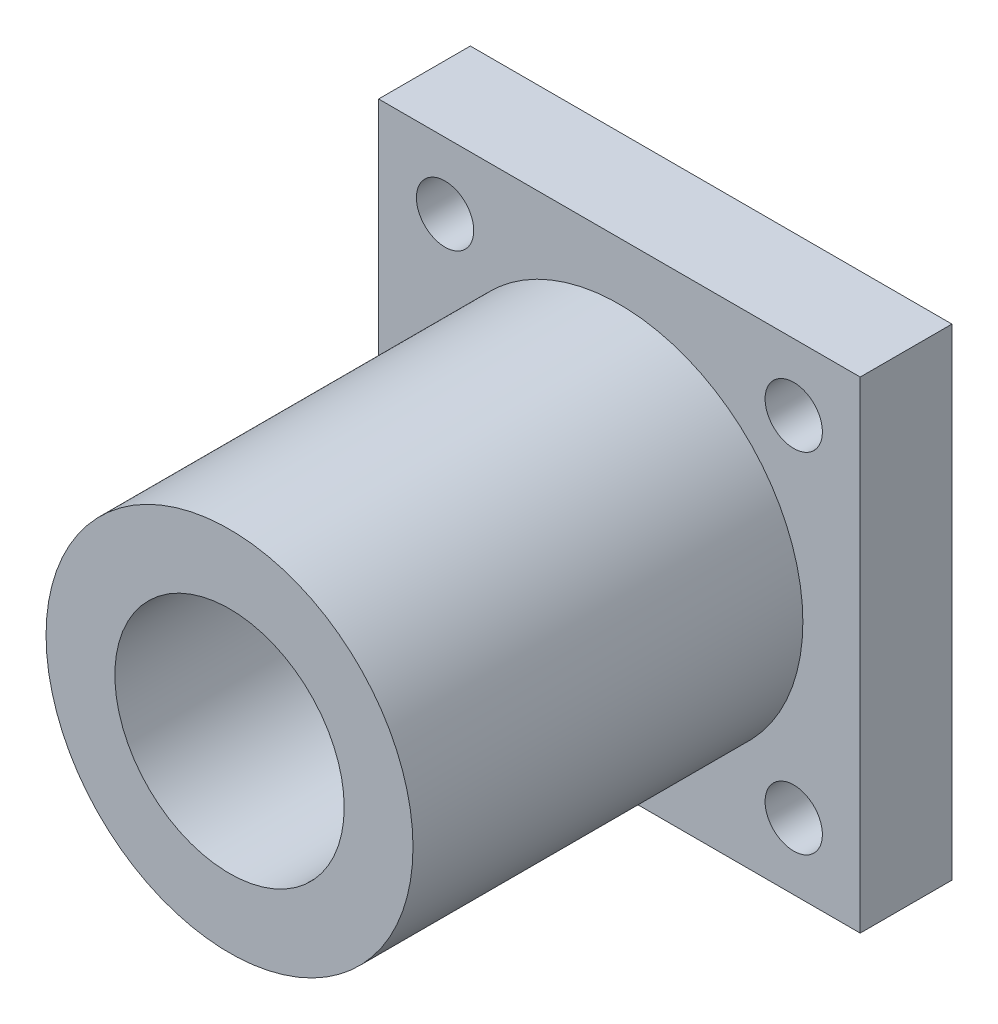
ISO-10303-21;
HEADER;
FILE_DESCRIPTION(('STEP AP214'),'2;1');
FILE_NAME('part.step','',(''),(''),'','','');
FILE_SCHEMA(('AUTOMOTIVE_DESIGN { 1 0 10303 214 1 1 1 1 }'));
ENDSEC;
DATA;
#1=APPLICATION_CONTEXT('core data for automotive mechanical design processes');
#2=APPLICATION_PROTOCOL_DEFINITION('international standard','automotive_design',2000,#1);
#3=PRODUCT_CONTEXT('',#1,'mechanical');
#4=PRODUCT('Part','Part','',(#3));
#5=PRODUCT_RELATED_PRODUCT_CATEGORY('part','',(#4));
#6=PRODUCT_DEFINITION_FORMATION('','',#4);
#7=PRODUCT_DEFINITION_CONTEXT('part definition',#1,'design');
#8=PRODUCT_DEFINITION('design','',#6,#7);
#9=PRODUCT_DEFINITION_SHAPE('','',#8);
#10=(LENGTH_UNIT() NAMED_UNIT(*) SI_UNIT(.MILLI.,.METRE.));
#11=(NAMED_UNIT(*) PLANE_ANGLE_UNIT() SI_UNIT($,.RADIAN.));
#12=(NAMED_UNIT(*) SI_UNIT($,.STERADIAN.) SOLID_ANGLE_UNIT());
#13=UNCERTAINTY_MEASURE_WITH_UNIT(LENGTH_MEASURE(1.E-05),#10,'distance_accuracy_value','');
#14=(GEOMETRIC_REPRESENTATION_CONTEXT(3) GLOBAL_UNCERTAINTY_ASSIGNED_CONTEXT((#13)) GLOBAL_UNIT_ASSIGNED_CONTEXT((#10,
#11,#12)) REPRESENTATION_CONTEXT('',''));
#15=CARTESIAN_POINT('',(0.,0.,0.));
#16=DIRECTION('',(0.,0.,1.));
#17=DIRECTION('',(1.,0.,0.));
#18=AXIS2_PLACEMENT_3D('',#15,#16,#17);
#19=CARTESIAN_POINT('',(-21.,0.,8.));
#20=DIRECTION('',(-1.,0.,0.));
#21=DIRECTION('',(0.,0.,1.));
#22=AXIS2_PLACEMENT_3D('',#19,#20,#21);
#23=PLANE('',#22);
#24=DIRECTION('',(0.,1.,0.));
#25=VECTOR('',#24,1.);
#26=CARTESIAN_POINT('',(-21.,0.,0.));
#27=LINE('',#26,#25);
#28=CARTESIAN_POINT('',(-21.,-21.,0.));
#29=VERTEX_POINT('',#28);
#30=CARTESIAN_POINT('',(-21.,21.,0.));
#31=VERTEX_POINT('',#30);
#32=EDGE_CURVE('E117',#29,#31,#27,.T.);
#33=ORIENTED_EDGE('',*,*,#32,.F.);
#34=DIRECTION('',(0.,0.,-1.));
#35=VECTOR('',#34,1.);
#36=CARTESIAN_POINT('',(-21.,-21.,8.));
#37=LINE('',#36,#35);
#38=CARTESIAN_POINT('',(-21.,-21.,8.));
#39=VERTEX_POINT('',#38);
#40=EDGE_CURVE('E11',#39,#29,#37,.T.);
#41=ORIENTED_EDGE('',*,*,#40,.F.);
#42=DIRECTION('',(0.,1.,0.));
#43=VECTOR('',#42,1.);
#44=CARTESIAN_POINT('',(-21.,0.,8.));
#45=LINE('',#44,#43);
#46=CARTESIAN_POINT('',(-21.,21.,8.));
#47=VERTEX_POINT('',#46);
#48=EDGE_CURVE('E97',#39,#47,#45,.T.);
#49=ORIENTED_EDGE('',*,*,#48,.T.);
#50=DIRECTION('',(0.,0.,-1.));
#51=VECTOR('',#50,1.);
#52=CARTESIAN_POINT('',(-21.,21.,8.));
#53=LINE('',#52,#51);
#54=EDGE_CURVE('E76',#47,#31,#53,.T.);
#55=ORIENTED_EDGE('',*,*,#54,.T.);
#56=EDGE_LOOP('',(#33,#41,#49,#55));
#57=FACE_BOUND('',#56,.T.);
#58=ADVANCED_FACE('F36',(#57),#23,.T.);
#59=CARTESIAN_POINT('',(0.,-21.,8.));
#60=DIRECTION('',(0.,-1.,0.));
#61=DIRECTION('',(1.,0.,0.));
#62=AXIS2_PLACEMENT_3D('',#59,#60,#61);
#63=PLANE('',#62);
#64=DIRECTION('',(-1.,0.,0.));
#65=VECTOR('',#64,1.);
#66=CARTESIAN_POINT('',(0.,-21.,0.));
#67=LINE('',#66,#65);
#68=CARTESIAN_POINT('',(21.,-21.,0.));
#69=VERTEX_POINT('',#68);
#70=EDGE_CURVE('E88',#69,#29,#67,.T.);
#71=ORIENTED_EDGE('',*,*,#70,.F.);
#72=DIRECTION('',(0.,0.,-1.));
#73=VECTOR('',#72,1.);
#74=CARTESIAN_POINT('',(21.,-21.,8.));
#75=LINE('',#74,#73);
#76=CARTESIAN_POINT('',(21.,-21.,8.));
#77=VERTEX_POINT('',#76);
#78=EDGE_CURVE('E45',#77,#69,#75,.T.);
#79=ORIENTED_EDGE('',*,*,#78,.F.);
#80=DIRECTION('',(-1.,0.,0.));
#81=VECTOR('',#80,1.);
#82=CARTESIAN_POINT('',(0.,-21.,8.));
#83=LINE('',#82,#81);
#84=EDGE_CURVE('E86',#77,#39,#83,.T.);
#85=ORIENTED_EDGE('',*,*,#84,.T.);
#86=ORIENTED_EDGE('',*,*,#40,.T.);
#87=EDGE_LOOP('',(#71,#79,#85,#86));
#88=FACE_BOUND('',#87,.T.);
#89=ADVANCED_FACE('F84',(#88),#63,.T.);
#90=CARTESIAN_POINT('',(21.,0.,8.));
#91=DIRECTION('',(-1.,0.,0.));
#92=DIRECTION('',(0.,0.,1.));
#93=AXIS2_PLACEMENT_3D('',#90,#91,#92);
#94=PLANE('',#93);
#95=DIRECTION('',(0.,1.,0.));
#96=VECTOR('',#95,1.);
#97=CARTESIAN_POINT('',(21.,0.,0.));
#98=LINE('',#97,#96);
#99=CARTESIAN_POINT('',(21.,21.,0.));
#100=VERTEX_POINT('',#99);
#101=EDGE_CURVE('E120',#69,#100,#98,.T.);
#102=ORIENTED_EDGE('',*,*,#101,.T.);
#103=DIRECTION('',(0.,0.,-1.));
#104=VECTOR('',#103,1.);
#105=CARTESIAN_POINT('',(21.,21.,8.));
#106=LINE('',#105,#104);
#107=CARTESIAN_POINT('',(21.,21.,8.));
#108=VERTEX_POINT('',#107);
#109=EDGE_CURVE('E91',#108,#100,#106,.T.);
#110=ORIENTED_EDGE('',*,*,#109,.F.);
#111=DIRECTION('',(0.,1.,0.));
#112=VECTOR('',#111,1.);
#113=CARTESIAN_POINT('',(21.,0.,8.));
#114=LINE('',#113,#112);
#115=EDGE_CURVE('E93',#77,#108,#114,.T.);
#116=ORIENTED_EDGE('',*,*,#115,.F.);
#117=ORIENTED_EDGE('',*,*,#78,.T.);
#118=EDGE_LOOP('',(#102,#110,#116,#117));
#119=FACE_BOUND('',#118,.T.);
#120=ADVANCED_FACE('F94',(#119),#94,.F.);
#121=CARTESIAN_POINT('',(0.,21.,8.));
#122=DIRECTION('',(0.,-1.,0.));
#123=DIRECTION('',(1.,0.,0.));
#124=AXIS2_PLACEMENT_3D('',#121,#122,#123);
#125=PLANE('',#124);
#126=DIRECTION('',(-1.,0.,0.));
#127=VECTOR('',#126,1.);
#128=CARTESIAN_POINT('',(0.,21.,0.));
#129=LINE('',#128,#127);
#130=EDGE_CURVE('E69',#100,#31,#129,.T.);
#131=ORIENTED_EDGE('',*,*,#130,.T.);
#132=ORIENTED_EDGE('',*,*,#54,.F.);
#133=DIRECTION('',(-1.,0.,0.));
#134=VECTOR('',#133,1.);
#135=CARTESIAN_POINT('',(0.,21.,8.));
#136=LINE('',#135,#134);
#137=EDGE_CURVE('E53',#108,#47,#136,.T.);
#138=ORIENTED_EDGE('',*,*,#137,.F.);
#139=ORIENTED_EDGE('',*,*,#109,.T.);
#140=EDGE_LOOP('',(#131,#132,#138,#139));
#141=FACE_BOUND('',#140,.T.);
#142=ADVANCED_FACE('F129',(#141),#125,.F.);
#143=CARTESIAN_POINT('',(-15.2027957955108,15.2027957955108,8.));
#144=DIRECTION('',(0.,0.,-1.));
#145=DIRECTION('',(-1.,0.,0.));
#146=AXIS2_PLACEMENT_3D('',#143,#144,#145);
#147=CYLINDRICAL_SURFACE('',#146,2.5);
#148=CARTESIAN_POINT('',(-15.2027957955108,15.2027957955108,8.));
#149=DIRECTION('',(0.,0.,1.));
#150=DIRECTION('',(1.,0.,0.));
#151=AXIS2_PLACEMENT_3D('',#148,#149,#150);
#152=CIRCLE('',#151,2.5);
#153=CARTESIAN_POINT('',(-12.7027957955108,15.2027957955108,8.));
#154=VERTEX_POINT('',#153);
#155=EDGE_CURVE('E99',#154,#154,#152,.T.);
#156=ORIENTED_EDGE('',*,*,#155,.T.);
#157=EDGE_LOOP('',(#156));
#158=FACE_BOUND('',#157,.T.);
#159=CARTESIAN_POINT('',(-15.2027957955108,15.2027957955108,0.));
#160=DIRECTION('',(0.,0.,1.));
#161=DIRECTION('',(1.,0.,0.));
#162=AXIS2_PLACEMENT_3D('',#159,#160,#161);
#163=CIRCLE('',#162,2.5);
#164=CARTESIAN_POINT('',(-12.7027957955108,15.2027957955108,0.));
#165=VERTEX_POINT('',#164);
#166=EDGE_CURVE('E114',#165,#165,#163,.T.);
#167=ORIENTED_EDGE('',*,*,#166,.F.);
#168=EDGE_LOOP('',(#167));
#169=FACE_BOUND('',#168,.T.);
#170=ADVANCED_FACE('F140',(#158,#169),#147,.F.);
#171=CARTESIAN_POINT('',(15.2027957955108,15.2027957955108,8.));
#172=DIRECTION('',(0.,0.,-1.));
#173=DIRECTION('',(-1.,0.,0.));
#174=AXIS2_PLACEMENT_3D('',#171,#172,#173);
#175=CYLINDRICAL_SURFACE('',#174,2.5);
#176=CARTESIAN_POINT('',(15.2027957955108,15.2027957955108,8.));
#177=DIRECTION('',(0.,0.,1.));
#178=DIRECTION('',(1.,0.,0.));
#179=AXIS2_PLACEMENT_3D('',#176,#177,#178);
#180=CIRCLE('',#179,2.5);
#181=CARTESIAN_POINT('',(17.7027957955108,15.2027957955108,8.));
#182=VERTEX_POINT('',#181);
#183=EDGE_CURVE('E266',#182,#182,#180,.T.);
#184=ORIENTED_EDGE('',*,*,#183,.T.);
#185=EDGE_LOOP('',(#184));
#186=FACE_BOUND('',#185,.T.);
#187=CARTESIAN_POINT('',(15.2027957955108,15.2027957955108,0.));
#188=DIRECTION('',(0.,0.,1.));
#189=DIRECTION('',(1.,0.,0.));
#190=AXIS2_PLACEMENT_3D('',#187,#188,#189);
#191=CIRCLE('',#190,2.5);
#192=CARTESIAN_POINT('',(17.7027957955108,15.2027957955108,0.));
#193=VERTEX_POINT('',#192);
#194=EDGE_CURVE('E111',#193,#193,#191,.T.);
#195=ORIENTED_EDGE('',*,*,#194,.F.);
#196=EDGE_LOOP('',(#195));
#197=FACE_BOUND('',#196,.T.);
#198=ADVANCED_FACE('F143',(#186,#197),#175,.F.);
#199=CARTESIAN_POINT('',(15.2027957955108,-15.2027957955108,8.));
#200=DIRECTION('',(0.,0.,-1.));
#201=DIRECTION('',(-1.,0.,0.));
#202=AXIS2_PLACEMENT_3D('',#199,#200,#201);
#203=CYLINDRICAL_SURFACE('',#202,2.5);
#204=CARTESIAN_POINT('',(15.2027957955108,-15.2027957955108,8.));
#205=DIRECTION('',(0.,0.,1.));
#206=DIRECTION('',(1.,0.,0.));
#207=AXIS2_PLACEMENT_3D('',#204,#205,#206);
#208=CIRCLE('',#207,2.5);
#209=CARTESIAN_POINT('',(17.7027957955108,-15.2027957955108,8.));
#210=VERTEX_POINT('',#209);
#211=EDGE_CURVE('E158',#210,#210,#208,.T.);
#212=ORIENTED_EDGE('',*,*,#211,.T.);
#213=EDGE_LOOP('',(#212));
#214=FACE_BOUND('',#213,.T.);
#215=CARTESIAN_POINT('',(15.2027957955108,-15.2027957955108,0.));
#216=DIRECTION('',(0.,0.,1.));
#217=DIRECTION('',(1.,0.,0.));
#218=AXIS2_PLACEMENT_3D('',#215,#216,#217);
#219=CIRCLE('',#218,2.5);
#220=CARTESIAN_POINT('',(17.7027957955108,-15.2027957955108,0.));
#221=VERTEX_POINT('',#220);
#222=EDGE_CURVE('E107',#221,#221,#219,.T.);
#223=ORIENTED_EDGE('',*,*,#222,.F.);
#224=EDGE_LOOP('',(#223));
#225=FACE_BOUND('',#224,.T.);
#226=ADVANCED_FACE('F146',(#214,#225),#203,.F.);
#227=CARTESIAN_POINT('',(-15.2027957955108,-15.2027957955108,8.));
#228=DIRECTION('',(0.,0.,-1.));
#229=DIRECTION('',(-1.,0.,0.));
#230=AXIS2_PLACEMENT_3D('',#227,#228,#229);
#231=CYLINDRICAL_SURFACE('',#230,2.5);
#232=CARTESIAN_POINT('',(-15.2027957955108,-15.2027957955108,8.));
#233=DIRECTION('',(0.,0.,1.));
#234=DIRECTION('',(1.,0.,0.));
#235=AXIS2_PLACEMENT_3D('',#232,#233,#234);
#236=CIRCLE('',#235,2.5);
#237=CARTESIAN_POINT('',(-12.7027957955108,-15.2027957955108,8.));
#238=VERTEX_POINT('',#237);
#239=EDGE_CURVE('E126',#238,#238,#236,.T.);
#240=ORIENTED_EDGE('',*,*,#239,.T.);
#241=EDGE_LOOP('',(#240));
#242=FACE_BOUND('',#241,.T.);
#243=CARTESIAN_POINT('',(-15.2027957955108,-15.2027957955108,0.));
#244=DIRECTION('',(0.,0.,1.));
#245=DIRECTION('',(1.,0.,0.));
#246=AXIS2_PLACEMENT_3D('',#243,#244,#245);
#247=CIRCLE('',#246,2.5);
#248=CARTESIAN_POINT('',(-12.7027957955108,-15.2027957955108,0.));
#249=VERTEX_POINT('',#248);
#250=EDGE_CURVE('E104',#249,#249,#247,.T.);
#251=ORIENTED_EDGE('',*,*,#250,.F.);
#252=EDGE_LOOP('',(#251));
#253=FACE_BOUND('',#252,.T.);
#254=ADVANCED_FACE('F38',(#242,#253),#231,.F.);
#255=CARTESIAN_POINT('',(0.,0.,8.));
#256=DIRECTION('',(0.,0.,-1.));
#257=DIRECTION('',(-1.,0.,0.));
#258=AXIS2_PLACEMENT_3D('',#255,#256,#257);
#259=CYLINDRICAL_SURFACE('',#258,10.);
#260=CARTESIAN_POINT('',(0.,0.,0.));
#261=DIRECTION('',(0.,0.,1.));
#262=DIRECTION('',(1.,0.,0.));
#263=AXIS2_PLACEMENT_3D('',#260,#261,#262);
#264=CIRCLE('',#263,10.);
#265=CARTESIAN_POINT('',(10.,0.,0.));
#266=VERTEX_POINT('',#265);
#267=EDGE_CURVE('E123',#266,#266,#264,.T.);
#268=ORIENTED_EDGE('',*,*,#267,.F.);
#269=EDGE_LOOP('',(#268));
#270=FACE_BOUND('',#269,.T.);
#271=CARTESIAN_POINT('',(0.,0.,42.));
#272=DIRECTION('',(0.,0.,1.));
#273=DIRECTION('',(1.,0.,0.));
#274=AXIS2_PLACEMENT_3D('',#271,#272,#273);
#275=CIRCLE('',#274,10.);
#276=CARTESIAN_POINT('',(10.,0.,42.));
#277=VERTEX_POINT('',#276);
#278=EDGE_CURVE('E253',#277,#277,#275,.T.);
#279=ORIENTED_EDGE('',*,*,#278,.T.);
#280=EDGE_LOOP('',(#279));
#281=FACE_BOUND('',#280,.T.);
#282=ADVANCED_FACE('F153',(#270,#281),#259,.F.);
#283=CARTESIAN_POINT('',(0.,0.,8.));
#284=DIRECTION('',(0.,0.,1.));
#285=DIRECTION('',(1.,0.,0.));
#286=AXIS2_PLACEMENT_3D('',#283,#284,#285);
#287=PLANE('',#286);
#288=CARTESIAN_POINT('',(0.,0.,8.));
#289=DIRECTION('',(0.,0.,1.));
#290=DIRECTION('',(1.,0.,0.));
#291=AXIS2_PLACEMENT_3D('',#288,#289,#290);
#292=CIRCLE('',#291,16.);
#293=CARTESIAN_POINT('',(-16.,0.,7.99999999999999));
#294=VERTEX_POINT('',#293);
#295=EDGE_CURVE('E108',#294,#294,#292,.F.);
#296=ORIENTED_EDGE('',*,*,#295,.T.);
#297=EDGE_LOOP('',(#296));
#298=FACE_BOUND('',#297,.T.);
#299=ORIENTED_EDGE('',*,*,#239,.F.);
#300=EDGE_LOOP('',(#299));
#301=FACE_BOUND('',#300,.T.);
#302=ORIENTED_EDGE('',*,*,#211,.F.);
#303=EDGE_LOOP('',(#302));
#304=FACE_BOUND('',#303,.T.);
#305=ORIENTED_EDGE('',*,*,#183,.F.);
#306=EDGE_LOOP('',(#305));
#307=FACE_BOUND('',#306,.T.);
#308=ORIENTED_EDGE('',*,*,#155,.F.);
#309=EDGE_LOOP('',(#308));
#310=FACE_BOUND('',#309,.T.);
#311=ORIENTED_EDGE('',*,*,#48,.F.);
#312=ORIENTED_EDGE('',*,*,#84,.F.);
#313=ORIENTED_EDGE('',*,*,#115,.T.);
#314=ORIENTED_EDGE('',*,*,#137,.T.);
#315=EDGE_LOOP('',(#311,#312,#313,#314));
#316=FACE_BOUND('',#315,.T.);
#317=ADVANCED_FACE('F96',(#298,#301,#304,#307,#310,#316),#287,.T.);
#318=CARTESIAN_POINT('',(0.,0.,0.));
#319=DIRECTION('',(0.,0.,1.));
#320=DIRECTION('',(1.,0.,0.));
#321=AXIS2_PLACEMENT_3D('',#318,#319,#320);
#322=PLANE('',#321);
#323=ORIENTED_EDGE('',*,*,#250,.T.);
#324=EDGE_LOOP('',(#323));
#325=FACE_BOUND('',#324,.T.);
#326=ORIENTED_EDGE('',*,*,#222,.T.);
#327=EDGE_LOOP('',(#326));
#328=FACE_BOUND('',#327,.T.);
#329=ORIENTED_EDGE('',*,*,#194,.T.);
#330=EDGE_LOOP('',(#329));
#331=FACE_BOUND('',#330,.T.);
#332=ORIENTED_EDGE('',*,*,#166,.T.);
#333=EDGE_LOOP('',(#332));
#334=FACE_BOUND('',#333,.T.);
#335=ORIENTED_EDGE('',*,*,#32,.T.);
#336=ORIENTED_EDGE('',*,*,#130,.F.);
#337=ORIENTED_EDGE('',*,*,#101,.F.);
#338=ORIENTED_EDGE('',*,*,#70,.T.);
#339=EDGE_LOOP('',(#335,#336,#337,#338));
#340=FACE_BOUND('',#339,.T.);
#341=ORIENTED_EDGE('',*,*,#267,.T.);
#342=EDGE_LOOP('',(#341));
#343=FACE_BOUND('',#342,.T.);
#344=ADVANCED_FACE('F130',(#325,#328,#331,#334,#340,#343),#322,.F.);
#345=CARTESIAN_POINT('',(0.,0.,42.));
#346=DIRECTION('',(0.,0.,-1.));
#347=DIRECTION('',(-1.,0.,0.));
#348=AXIS2_PLACEMENT_3D('',#345,#346,#347);
#349=CYLINDRICAL_SURFACE('',#348,16.);
#350=CARTESIAN_POINT('',(0.,0.,42.));
#351=DIRECTION('',(0.,0.,1.));
#352=DIRECTION('',(1.,0.,0.));
#353=AXIS2_PLACEMENT_3D('',#350,#351,#352);
#354=CIRCLE('',#353,16.);
#355=CARTESIAN_POINT('',(-16.,0.,42.));
#356=VERTEX_POINT('',#355);
#357=EDGE_CURVE('E256',#356,#356,#354,.T.);
#358=CARTESIAN_POINT('',(-16.,0.,7.99999999999999));
#359=CARTESIAN_POINT('',(-16.,0.,8.35416666666666));
#360=CARTESIAN_POINT('',(-16.,0.,8.70833333333333));
#361=CARTESIAN_POINT('',(-16.,0.,9.41666666666666));
#362=CARTESIAN_POINT('',(-16.,0.,9.77083333333333));
#363=CARTESIAN_POINT('',(-16.,0.,10.4791666666667));
#364=CARTESIAN_POINT('',(-16.,0.,10.8333333333333));
#365=CARTESIAN_POINT('',(-16.,0.,11.5416666666667));
#366=CARTESIAN_POINT('',(-16.,0.,11.8958333333333));
#367=CARTESIAN_POINT('',(-16.,0.,12.6041666666667));
#368=CARTESIAN_POINT('',(-16.,0.,12.9583333333333));
#369=CARTESIAN_POINT('',(-16.,0.,13.6666666666667));
#370=CARTESIAN_POINT('',(-16.,0.,14.0208333333333));
#371=CARTESIAN_POINT('',(-16.,0.,14.7291666666667));
#372=CARTESIAN_POINT('',(-16.,0.,15.0833333333333));
#373=CARTESIAN_POINT('',(-16.,0.,15.7916666666667));
#374=CARTESIAN_POINT('',(-16.,0.,16.1458333333333));
#375=CARTESIAN_POINT('',(-16.,0.,16.8541666666667));
#376=CARTESIAN_POINT('',(-16.,0.,17.2083333333333));
#377=CARTESIAN_POINT('',(-16.,0.,17.9166666666667));
#378=CARTESIAN_POINT('',(-16.,0.,18.2708333333333));
#379=CARTESIAN_POINT('',(-16.,0.,18.9791666666667));
#380=CARTESIAN_POINT('',(-16.,0.,19.3333333333333));
#381=CARTESIAN_POINT('',(-16.,0.,20.0416666666667));
#382=CARTESIAN_POINT('',(-16.,0.,20.3958333333333));
#383=CARTESIAN_POINT('',(-16.,0.,21.1041666666667));
#384=CARTESIAN_POINT('',(-16.,0.,21.4583333333333));
#385=CARTESIAN_POINT('',(-16.,0.,22.1666666666667));
#386=CARTESIAN_POINT('',(-16.,0.,22.5208333333333));
#387=CARTESIAN_POINT('',(-16.,0.,23.2291666666667));
#388=CARTESIAN_POINT('',(-16.,0.,23.5833333333333));
#389=CARTESIAN_POINT('',(-16.,0.,24.2916666666667));
#390=CARTESIAN_POINT('',(-16.,0.,24.6458333333333));
#391=CARTESIAN_POINT('',(-16.,0.,25.3541666666667));
#392=CARTESIAN_POINT('',(-16.,0.,25.7083333333333));
#393=CARTESIAN_POINT('',(-16.,0.,26.4166666666667));
#394=CARTESIAN_POINT('',(-16.,0.,26.7708333333333));
#395=CARTESIAN_POINT('',(-16.,0.,27.4791666666667));
#396=CARTESIAN_POINT('',(-16.,0.,27.8333333333333));
#397=CARTESIAN_POINT('',(-16.,0.,28.5416666666667));
#398=CARTESIAN_POINT('',(-16.,0.,28.8958333333333));
#399=CARTESIAN_POINT('',(-16.,0.,29.6041666666667));
#400=CARTESIAN_POINT('',(-16.,0.,29.9583333333333));
#401=CARTESIAN_POINT('',(-16.,0.,30.6666666666667));
#402=CARTESIAN_POINT('',(-16.,0.,31.0208333333333));
#403=CARTESIAN_POINT('',(-16.,0.,31.7291666666667));
#404=CARTESIAN_POINT('',(-16.,0.,32.0833333333333));
#405=CARTESIAN_POINT('',(-16.,0.,32.7916666666667));
#406=CARTESIAN_POINT('',(-16.,0.,33.1458333333333));
#407=CARTESIAN_POINT('',(-16.,0.,33.8541666666667));
#408=CARTESIAN_POINT('',(-16.,0.,34.2083333333333));
#409=CARTESIAN_POINT('',(-16.,0.,34.9166666666667));
#410=CARTESIAN_POINT('',(-16.,0.,35.2708333333333));
#411=CARTESIAN_POINT('',(-16.,0.,35.9791666666667));
#412=CARTESIAN_POINT('',(-16.,0.,36.3333333333333));
#413=CARTESIAN_POINT('',(-16.,0.,37.0416666666667));
#414=CARTESIAN_POINT('',(-16.,0.,37.3958333333333));
#415=CARTESIAN_POINT('',(-16.,0.,38.1041666666667));
#416=CARTESIAN_POINT('',(-16.,0.,38.4583333333333));
#417=CARTESIAN_POINT('',(-16.,0.,39.1666666666667));
#418=CARTESIAN_POINT('',(-16.,0.,39.5208333333333));
#419=CARTESIAN_POINT('',(-16.,0.,40.2291666666667));
#420=CARTESIAN_POINT('',(-16.,0.,40.5833333333333));
#421=CARTESIAN_POINT('',(-16.,0.,41.2916666666667));
#422=CARTESIAN_POINT('',(-16.,0.,41.6458333333333));
#423=CARTESIAN_POINT('',(-16.,0.,42.));
#424=B_SPLINE_CURVE_WITH_KNOTS('',3,(#358,#359,#360,#361,#362,#363,#364,#365,#366,#367,#368,
#369,#370,#371,#372,#373,#374,#375,#376,#377,#378,#379,#380,#381,#382,#383,#384,#385,#386,#387,
#388,#389,#390,#391,#392,#393,#394,#395,#396,#397,#398,#399,#400,#401,#402,#403,#404,#405,#406,
#407,#408,#409,#410,#411,#412,#413,#414,#415,#416,#417,#418,#419,#420,#421,#422,#423),
.UNSPECIFIED.,.F.,.F.,(4,2,2,2,2,2,2,2,2,2,2,2,2,2,2,2,2,2,2,2,2,2,2,2,2,2,2,2,2,2,2,2,4),(0.,
1.0625,2.125,3.1875,4.25,5.3125,6.375,7.4375,8.5,9.5625,10.625,11.6875,12.75,13.8125,14.875,
15.9375,17.,18.0625,19.125,20.1875,21.25,22.3125,23.375,24.4375,25.5,26.5625,27.625,28.6875,
29.75,30.8125,31.875,32.9375,34.),.UNSPECIFIED.);
#425=EDGE_CURVE('BSEAM163',#294,#356,#424,.T.);
#426=ORIENTED_EDGE('',*,*,#295,.F.);
#427=ORIENTED_EDGE('',*,*,#357,.F.);
#428=ORIENTED_EDGE('',*,*,#425,.T.);
#429=ORIENTED_EDGE('',*,*,#425,.F.);
#430=EDGE_LOOP('',(#426,#428,#427,#429));
#431=FACE_BOUND('',#430,.T.);
#432=ADVANCED_FACE('F163',(#431),#349,.T.);
#433=CARTESIAN_POINT('',(0.,0.,42.));
#434=DIRECTION('',(0.,0.,1.));
#435=DIRECTION('',(1.,0.,0.));
#436=AXIS2_PLACEMENT_3D('',#433,#434,#435);
#437=PLANE('',#436);
#438=ORIENTED_EDGE('',*,*,#278,.F.);
#439=EDGE_LOOP('',(#438));
#440=FACE_BOUND('',#439,.T.);
#441=ORIENTED_EDGE('',*,*,#357,.T.);
#442=EDGE_LOOP('',(#441));
#443=FACE_BOUND('',#442,.T.);
#444=ADVANCED_FACE('F175',(#440,#443),#437,.T.);
#445=CLOSED_SHELL('',(#58,#89,#120,#142,#170,#198,#226,#254,#282,#317,#344,#432,#444));
#446=MANIFOLD_SOLID_BREP('B2',#445);
#447=ADVANCED_BREP_SHAPE_REPRESENTATION('',(#18,#446),#14);
#448=SHAPE_DEFINITION_REPRESENTATION(#9,#447);
ENDSEC;
END-ISO-10303-21;
